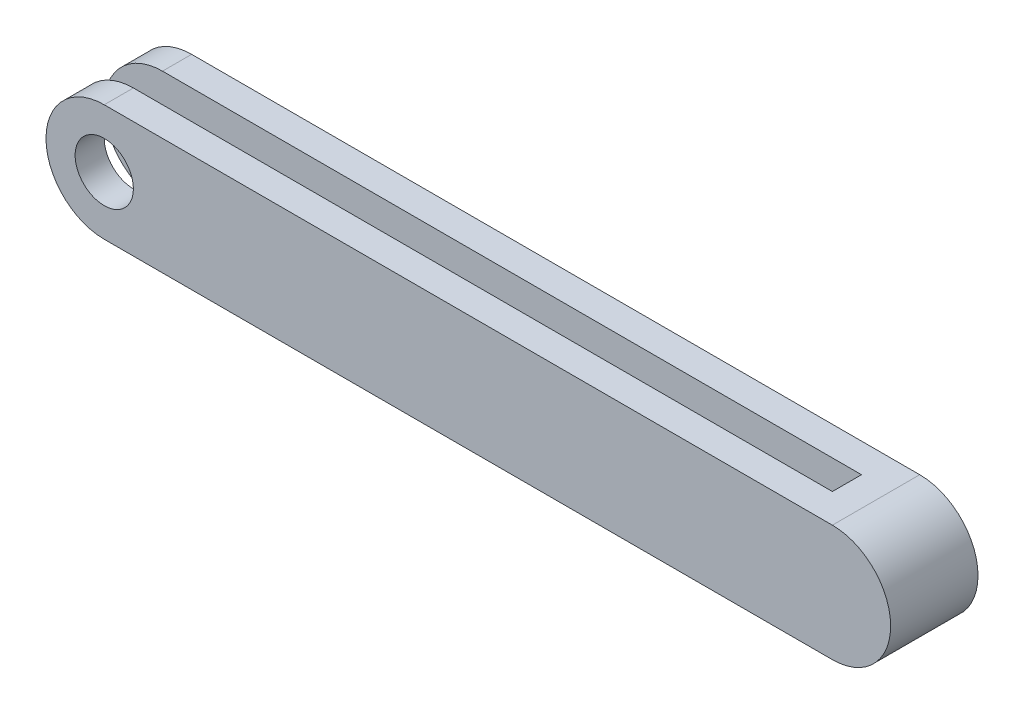
ISO-10303-21;
HEADER;
FILE_DESCRIPTION(('STEP AP214'),'2;1');
FILE_NAME('part.step','',(''),(''),'','','');
FILE_SCHEMA(('AUTOMOTIVE_DESIGN { 1 0 10303 214 1 1 1 1 }'));
ENDSEC;
DATA;
#1=APPLICATION_CONTEXT('core data for automotive mechanical design processes');
#2=APPLICATION_PROTOCOL_DEFINITION('international standard','automotive_design',2000,#1);
#3=PRODUCT_CONTEXT('',#1,'mechanical');
#4=PRODUCT('Part','Part','',(#3));
#5=PRODUCT_RELATED_PRODUCT_CATEGORY('part','',(#4));
#6=PRODUCT_DEFINITION_FORMATION('','',#4);
#7=PRODUCT_DEFINITION_CONTEXT('part definition',#1,'design');
#8=PRODUCT_DEFINITION('design','',#6,#7);
#9=PRODUCT_DEFINITION_SHAPE('','',#8);
#10=(LENGTH_UNIT() NAMED_UNIT(*) SI_UNIT(.MILLI.,.METRE.));
#11=(NAMED_UNIT(*) PLANE_ANGLE_UNIT() SI_UNIT($,.RADIAN.));
#12=(NAMED_UNIT(*) SI_UNIT($,.STERADIAN.) SOLID_ANGLE_UNIT());
#13=UNCERTAINTY_MEASURE_WITH_UNIT(LENGTH_MEASURE(1.E-05),#10,'distance_accuracy_value','');
#14=(GEOMETRIC_REPRESENTATION_CONTEXT(3) GLOBAL_UNCERTAINTY_ASSIGNED_CONTEXT((#13)) GLOBAL_UNIT_ASSIGNED_CONTEXT((#10,
#11,#12)) REPRESENTATION_CONTEXT('',''));
#15=CARTESIAN_POINT('',(0.,0.,0.));
#16=DIRECTION('',(0.,0.,1.));
#17=DIRECTION('',(1.,0.,0.));
#18=AXIS2_PLACEMENT_3D('',#15,#16,#17);
#19=CARTESIAN_POINT('',(0.,0.,15.));
#20=DIRECTION('',(0.,0.,-1.));
#21=DIRECTION('',(-1.,0.,0.));
#22=AXIS2_PLACEMENT_3D('',#19,#20,#21);
#23=CYLINDRICAL_SURFACE('',#22,10.);
#24=CARTESIAN_POINT('',(0.,0.,5.00000000000002));
#25=DIRECTION('',(0.,0.,-1.));
#26=DIRECTION('',(-1.,0.,0.));
#27=AXIS2_PLACEMENT_3D('',#24,#25,#26);
#28=CIRCLE('',#27,10.);
#29=CARTESIAN_POINT('',(0.,-10.,5.00000000000002));
#30=VERTEX_POINT('',#29);
#31=CARTESIAN_POINT('',(0.,10.,5.00000000000002));
#32=VERTEX_POINT('',#31);
#33=EDGE_CURVE('E139',#30,#32,#28,.T.);
#34=ORIENTED_EDGE('',*,*,#33,.T.);
#35=DIRECTION('',(0.,0.,-1.));
#36=VECTOR('',#35,1.);
#37=CARTESIAN_POINT('',(0.,10.,15.));
#38=LINE('',#37,#36);
#39=CARTESIAN_POINT('',(0.,10.,0.));
#40=VERTEX_POINT('',#39);
#41=EDGE_CURVE('E81',#32,#40,#38,.T.);
#42=ORIENTED_EDGE('',*,*,#41,.T.);
#43=CARTESIAN_POINT('',(0.,0.,0.));
#44=DIRECTION('',(0.,0.,1.));
#45=DIRECTION('',(1.,0.,0.));
#46=AXIS2_PLACEMENT_3D('',#43,#44,#45);
#47=CIRCLE('',#46,10.);
#48=CARTESIAN_POINT('',(0.,-10.,0.));
#49=VERTEX_POINT('',#48);
#50=EDGE_CURVE('E145',#40,#49,#47,.T.);
#51=ORIENTED_EDGE('',*,*,#50,.T.);
#52=DIRECTION('',(0.,0.,-1.));
#53=VECTOR('',#52,1.);
#54=CARTESIAN_POINT('',(0.,-10.,15.));
#55=LINE('',#54,#53);
#56=EDGE_CURVE('E42',#30,#49,#55,.T.);
#57=ORIENTED_EDGE('',*,*,#56,.F.);
#58=EDGE_LOOP('',(#34,#42,#51,#57));
#59=FACE_BOUND('',#58,.T.);
#60=ADVANCED_FACE('F33',(#59),#23,.T.);
#61=CARTESIAN_POINT('',(0.,0.,15.));
#62=DIRECTION('',(0.,0.,-1.));
#63=DIRECTION('',(-1.,0.,0.));
#64=AXIS2_PLACEMENT_3D('',#61,#62,#63);
#65=CYLINDRICAL_SURFACE('',#64,5.);
#66=CARTESIAN_POINT('',(0.,0.,5.00000000000002));
#67=DIRECTION('',(0.,0.,-1.));
#68=DIRECTION('',(-1.,0.,0.));
#69=AXIS2_PLACEMENT_3D('',#66,#67,#68);
#70=CIRCLE('',#69,5.);
#71=CARTESIAN_POINT('',(-5.,0.,5.00000000000002));
#72=VERTEX_POINT('',#71);
#73=EDGE_CURVE('E37',#72,#72,#70,.T.);
#74=ORIENTED_EDGE('',*,*,#73,.F.);
#75=EDGE_LOOP('',(#74));
#76=FACE_BOUND('',#75,.T.);
#77=CARTESIAN_POINT('',(0.,0.,0.));
#78=DIRECTION('',(0.,0.,1.));
#79=DIRECTION('',(1.,0.,0.));
#80=AXIS2_PLACEMENT_3D('',#77,#78,#79);
#81=CIRCLE('',#80,5.);
#82=CARTESIAN_POINT('',(5.,0.,0.));
#83=VERTEX_POINT('',#82);
#84=EDGE_CURVE('E141',#83,#83,#81,.T.);
#85=ORIENTED_EDGE('',*,*,#84,.F.);
#86=EDGE_LOOP('',(#85));
#87=FACE_BOUND('',#86,.T.);
#88=ADVANCED_FACE('F179',(#76,#87),#65,.F.);
#89=CARTESIAN_POINT('',(0.,0.,15.));
#90=DIRECTION('',(0.,0.,1.));
#91=DIRECTION('',(1.,0.,0.));
#92=AXIS2_PLACEMENT_3D('',#89,#90,#91);
#93=PLANE('',#92);
#94=CARTESIAN_POINT('',(0.,0.,15.));
#95=DIRECTION('',(0.,0.,1.));
#96=DIRECTION('',(1.,0.,0.));
#97=AXIS2_PLACEMENT_3D('',#94,#95,#96);
#98=CIRCLE('',#97,10.);
#99=CARTESIAN_POINT('',(0.,10.,15.));
#100=VERTEX_POINT('',#99);
#101=CARTESIAN_POINT('',(0.,-10.,15.));
#102=VERTEX_POINT('',#101);
#103=EDGE_CURVE('E148',#100,#102,#98,.T.);
#104=ORIENTED_EDGE('',*,*,#103,.T.);
#105=DIRECTION('',(1.,0.,0.));
#106=VECTOR('',#105,1.);
#107=CARTESIAN_POINT('',(0.,-10.,15.));
#108=LINE('',#107,#106);
#109=CARTESIAN_POINT('',(125.,-10.,15.));
#110=VERTEX_POINT('',#109);
#111=EDGE_CURVE('E88',#102,#110,#108,.T.);
#112=ORIENTED_EDGE('',*,*,#111,.T.);
#113=CARTESIAN_POINT('',(125.,0.,15.));
#114=DIRECTION('',(0.,0.,1.));
#115=DIRECTION('',(1.,0.,0.));
#116=AXIS2_PLACEMENT_3D('',#113,#114,#115);
#117=CIRCLE('',#116,10.);
#118=CARTESIAN_POINT('',(125.,10.,15.));
#119=VERTEX_POINT('',#118);
#120=EDGE_CURVE('E152',#110,#119,#117,.T.);
#121=ORIENTED_EDGE('',*,*,#120,.T.);
#122=DIRECTION('',(-1.,0.,0.));
#123=VECTOR('',#122,1.);
#124=CARTESIAN_POINT('',(0.,10.,15.));
#125=LINE('',#124,#123);
#126=EDGE_CURVE('E59',#119,#100,#125,.T.);
#127=ORIENTED_EDGE('',*,*,#126,.T.);
#128=EDGE_LOOP('',(#104,#112,#121,#127));
#129=FACE_BOUND('',#128,.T.);
#130=CARTESIAN_POINT('',(0.,0.,15.));
#131=DIRECTION('',(0.,0.,1.));
#132=DIRECTION('',(1.,0.,0.));
#133=AXIS2_PLACEMENT_3D('',#130,#131,#132);
#134=CIRCLE('',#133,5.);
#135=CARTESIAN_POINT('',(5.,0.,15.));
#136=VERTEX_POINT('',#135);
#137=EDGE_CURVE('E142',#136,#136,#134,.T.);
#138=ORIENTED_EDGE('',*,*,#137,.F.);
#139=EDGE_LOOP('',(#138));
#140=FACE_BOUND('',#139,.T.);
#141=ADVANCED_FACE('F182',(#129,#140),#93,.T.);
#142=CARTESIAN_POINT('',(0.,0.,0.));
#143=DIRECTION('',(0.,0.,1.));
#144=DIRECTION('',(1.,0.,0.));
#145=AXIS2_PLACEMENT_3D('',#142,#143,#144);
#146=PLANE('',#145);
#147=ORIENTED_EDGE('',*,*,#50,.F.);
#148=DIRECTION('',(-1.,0.,0.));
#149=VECTOR('',#148,1.);
#150=CARTESIAN_POINT('',(0.,10.,0.));
#151=LINE('',#150,#149);
#152=CARTESIAN_POINT('',(125.,10.,0.));
#153=VERTEX_POINT('',#152);
#154=EDGE_CURVE('E150',#153,#40,#151,.T.);
#155=ORIENTED_EDGE('',*,*,#154,.F.);
#156=CARTESIAN_POINT('',(125.,0.,0.));
#157=DIRECTION('',(0.,0.,1.));
#158=DIRECTION('',(1.,0.,0.));
#159=AXIS2_PLACEMENT_3D('',#156,#157,#158);
#160=CIRCLE('',#159,10.);
#161=CARTESIAN_POINT('',(125.,-10.,0.));
#162=VERTEX_POINT('',#161);
#163=EDGE_CURVE('E158',#162,#153,#160,.T.);
#164=ORIENTED_EDGE('',*,*,#163,.F.);
#165=DIRECTION('',(1.,0.,0.));
#166=VECTOR('',#165,1.);
#167=CARTESIAN_POINT('',(0.,-10.,0.));
#168=LINE('',#167,#166);
#169=EDGE_CURVE('E156',#49,#162,#168,.T.);
#170=ORIENTED_EDGE('',*,*,#169,.F.);
#171=EDGE_LOOP('',(#147,#155,#164,#170));
#172=FACE_BOUND('',#171,.T.);
#173=ORIENTED_EDGE('',*,*,#84,.T.);
#174=EDGE_LOOP('',(#173));
#175=FACE_BOUND('',#174,.T.);
#176=ADVANCED_FACE('F184',(#172,#175),#146,.F.);
#177=CARTESIAN_POINT('',(0.,10.,10.));
#178=VERTEX_POINT('',#177);
#179=EDGE_CURVE('E161',#100,#178,#38,.T.);
#180=ORIENTED_EDGE('',*,*,#179,.T.);
#181=CARTESIAN_POINT('',(0.,0.,10.));
#182=DIRECTION('',(0.,0.,1.));
#183=DIRECTION('',(1.,0.,0.));
#184=AXIS2_PLACEMENT_3D('',#181,#182,#183);
#185=CIRCLE('',#184,10.);
#186=CARTESIAN_POINT('',(0.,-10.,10.));
#187=VERTEX_POINT('',#186);
#188=EDGE_CURVE('E50',#178,#187,#185,.T.);
#189=ORIENTED_EDGE('',*,*,#188,.T.);
#190=EDGE_CURVE('E11',#102,#187,#55,.T.);
#191=ORIENTED_EDGE('',*,*,#190,.F.);
#192=ORIENTED_EDGE('',*,*,#103,.F.);
#193=EDGE_LOOP('',(#180,#189,#191,#192));
#194=FACE_BOUND('',#193,.T.);
#195=ADVANCED_FACE('F35',(#194),#23,.T.);
#196=CARTESIAN_POINT('',(0.,-10.,15.));
#197=DIRECTION('',(0.,1.,0.));
#198=DIRECTION('',(0.,0.,1.));
#199=AXIS2_PLACEMENT_3D('',#196,#197,#198);
#200=PLANE('',#199);
#201=DIRECTION('',(0.,0.,-1.));
#202=VECTOR('',#201,1.);
#203=CARTESIAN_POINT('',(120.,-10.,10.));
#204=LINE('',#203,#202);
#205=CARTESIAN_POINT('',(120.,-10.,10.));
#206=VERTEX_POINT('',#205);
#207=CARTESIAN_POINT('',(120.,-10.,5.));
#208=VERTEX_POINT('',#207);
#209=EDGE_CURVE('E117',#206,#208,#204,.T.);
#210=ORIENTED_EDGE('',*,*,#209,.T.);
#211=DIRECTION('',(-1.,0.,0.));
#212=VECTOR('',#211,1.);
#213=CARTESIAN_POINT('',(120.,-10.,5.));
#214=LINE('',#213,#212);
#215=EDGE_CURVE('E126',#208,#30,#214,.T.);
#216=ORIENTED_EDGE('',*,*,#215,.T.);
#217=ORIENTED_EDGE('',*,*,#56,.T.);
#218=ORIENTED_EDGE('',*,*,#169,.T.);
#219=DIRECTION('',(0.,0.,-1.));
#220=VECTOR('',#219,1.);
#221=CARTESIAN_POINT('',(125.,-10.,15.));
#222=LINE('',#221,#220);
#223=EDGE_CURVE('E167',#110,#162,#222,.T.);
#224=ORIENTED_EDGE('',*,*,#223,.F.);
#225=ORIENTED_EDGE('',*,*,#111,.F.);
#226=ORIENTED_EDGE('',*,*,#190,.T.);
#227=DIRECTION('',(1.,0.,0.));
#228=VECTOR('',#227,1.);
#229=CARTESIAN_POINT('',(-10.,-10.,10.));
#230=LINE('',#229,#228);
#231=EDGE_CURVE('E111',#187,#206,#230,.T.);
#232=ORIENTED_EDGE('',*,*,#231,.T.);
#233=EDGE_LOOP('',(#210,#216,#217,#218,#224,#225,#226,#232));
#234=FACE_BOUND('',#233,.T.);
#235=ADVANCED_FACE('F124',(#234),#200,.F.);
#236=CARTESIAN_POINT('',(125.,0.,15.));
#237=DIRECTION('',(0.,0.,-1.));
#238=DIRECTION('',(-1.,0.,0.));
#239=AXIS2_PLACEMENT_3D('',#236,#237,#238);
#240=CYLINDRICAL_SURFACE('',#239,10.);
#241=ORIENTED_EDGE('',*,*,#163,.T.);
#242=DIRECTION('',(0.,0.,-1.));
#243=VECTOR('',#242,1.);
#244=CARTESIAN_POINT('',(125.,10.,15.));
#245=LINE('',#244,#243);
#246=EDGE_CURVE('E164',#119,#153,#245,.T.);
#247=ORIENTED_EDGE('',*,*,#246,.F.);
#248=ORIENTED_EDGE('',*,*,#120,.F.);
#249=ORIENTED_EDGE('',*,*,#223,.T.);
#250=EDGE_LOOP('',(#241,#247,#248,#249));
#251=FACE_BOUND('',#250,.T.);
#252=ADVANCED_FACE('F201',(#251),#240,.T.);
#253=CARTESIAN_POINT('',(0.,10.,15.));
#254=DIRECTION('',(0.,-1.,0.));
#255=DIRECTION('',(0.,0.,-1.));
#256=AXIS2_PLACEMENT_3D('',#253,#254,#255);
#257=PLANE('',#256);
#258=ORIENTED_EDGE('',*,*,#41,.F.);
#259=DIRECTION('',(-1.,0.,0.));
#260=VECTOR('',#259,1.);
#261=CARTESIAN_POINT('',(120.,10.,5.));
#262=LINE('',#261,#260);
#263=CARTESIAN_POINT('',(120.,10.,5.));
#264=VERTEX_POINT('',#263);
#265=EDGE_CURVE('E131',#264,#32,#262,.T.);
#266=ORIENTED_EDGE('',*,*,#265,.F.);
#267=DIRECTION('',(0.,0.,-1.));
#268=VECTOR('',#267,1.);
#269=CARTESIAN_POINT('',(120.,10.,10.));
#270=LINE('',#269,#268);
#271=CARTESIAN_POINT('',(120.,10.,10.));
#272=VERTEX_POINT('',#271);
#273=EDGE_CURVE('E128',#272,#264,#270,.T.);
#274=ORIENTED_EDGE('',*,*,#273,.F.);
#275=DIRECTION('',(1.,0.,0.));
#276=VECTOR('',#275,1.);
#277=CARTESIAN_POINT('',(-10.,10.,10.));
#278=LINE('',#277,#276);
#279=EDGE_CURVE('E112',#178,#272,#278,.T.);
#280=ORIENTED_EDGE('',*,*,#279,.F.);
#281=ORIENTED_EDGE('',*,*,#179,.F.);
#282=ORIENTED_EDGE('',*,*,#126,.F.);
#283=ORIENTED_EDGE('',*,*,#246,.T.);
#284=ORIENTED_EDGE('',*,*,#154,.T.);
#285=EDGE_LOOP('',(#258,#266,#274,#280,#281,#282,#283,#284));
#286=FACE_BOUND('',#285,.T.);
#287=ADVANCED_FACE('F177',(#286),#257,.F.);
#288=CARTESIAN_POINT('',(0.,0.,10.));
#289=DIRECTION('',(0.,0.,1.));
#290=DIRECTION('',(1.,0.,0.));
#291=AXIS2_PLACEMENT_3D('',#288,#289,#290);
#292=CIRCLE('',#291,5.);
#293=CARTESIAN_POINT('',(5.,0.,10.));
#294=VERTEX_POINT('',#293);
#295=EDGE_CURVE('E136',#294,#294,#292,.T.);
#296=ORIENTED_EDGE('',*,*,#295,.F.);
#297=EDGE_LOOP('',(#296));
#298=FACE_BOUND('',#297,.T.);
#299=ORIENTED_EDGE('',*,*,#137,.T.);
#300=EDGE_LOOP('',(#299));
#301=FACE_BOUND('',#300,.T.);
#302=ADVANCED_FACE('F173',(#298,#301),#65,.F.);
#303=CARTESIAN_POINT('',(120.,-10.,5.));
#304=DIRECTION('',(0.,0.,-1.));
#305=DIRECTION('',(-1.,0.,0.));
#306=AXIS2_PLACEMENT_3D('',#303,#304,#305);
#307=PLANE('',#306);
#308=ORIENTED_EDGE('',*,*,#73,.T.);
#309=EDGE_LOOP('',(#308));
#310=FACE_BOUND('',#309,.T.);
#311=ORIENTED_EDGE('',*,*,#33,.F.);
#312=ORIENTED_EDGE('',*,*,#215,.F.);
#313=DIRECTION('',(0.,1.,0.));
#314=VECTOR('',#313,1.);
#315=CARTESIAN_POINT('',(120.,-10.,5.));
#316=LINE('',#315,#314);
#317=EDGE_CURVE('E116',#208,#264,#316,.T.);
#318=ORIENTED_EDGE('',*,*,#317,.T.);
#319=ORIENTED_EDGE('',*,*,#265,.T.);
#320=EDGE_LOOP('',(#311,#312,#318,#319));
#321=FACE_BOUND('',#320,.T.);
#322=ADVANCED_FACE('F176',(#310,#321),#307,.F.);
#323=CARTESIAN_POINT('',(-10.,-10.,10.));
#324=DIRECTION('',(0.,0.,1.));
#325=DIRECTION('',(1.,0.,0.));
#326=AXIS2_PLACEMENT_3D('',#323,#324,#325);
#327=PLANE('',#326);
#328=ORIENTED_EDGE('',*,*,#295,.T.);
#329=EDGE_LOOP('',(#328));
#330=FACE_BOUND('',#329,.T.);
#331=ORIENTED_EDGE('',*,*,#279,.T.);
#332=DIRECTION('',(0.,1.,0.));
#333=VECTOR('',#332,1.);
#334=CARTESIAN_POINT('',(120.,-10.,10.));
#335=LINE('',#334,#333);
#336=EDGE_CURVE('E107',#206,#272,#335,.T.);
#337=ORIENTED_EDGE('',*,*,#336,.F.);
#338=ORIENTED_EDGE('',*,*,#231,.F.);
#339=ORIENTED_EDGE('',*,*,#188,.F.);
#340=EDGE_LOOP('',(#331,#337,#338,#339));
#341=FACE_BOUND('',#340,.T.);
#342=ADVANCED_FACE('F109',(#330,#341),#327,.F.);
#343=CARTESIAN_POINT('',(120.,-10.,10.));
#344=DIRECTION('',(1.,0.,0.));
#345=DIRECTION('',(0.,0.,-1.));
#346=AXIS2_PLACEMENT_3D('',#343,#344,#345);
#347=PLANE('',#346);
#348=ORIENTED_EDGE('',*,*,#273,.T.);
#349=ORIENTED_EDGE('',*,*,#317,.F.);
#350=ORIENTED_EDGE('',*,*,#209,.F.);
#351=ORIENTED_EDGE('',*,*,#336,.T.);
#352=EDGE_LOOP('',(#348,#349,#350,#351));
#353=FACE_BOUND('',#352,.T.);
#354=ADVANCED_FACE('F120',(#353),#347,.F.);
#355=CLOSED_SHELL('',(#60,#88,#141,#176,#195,#235,#252,#287,#302,#322,#342,#354));
#356=MANIFOLD_SOLID_BREP('B2',#355);
#357=ADVANCED_BREP_SHAPE_REPRESENTATION('',(#18,#356),#14);
#358=SHAPE_DEFINITION_REPRESENTATION(#9,#357);
ENDSEC;
END-ISO-10303-21;
